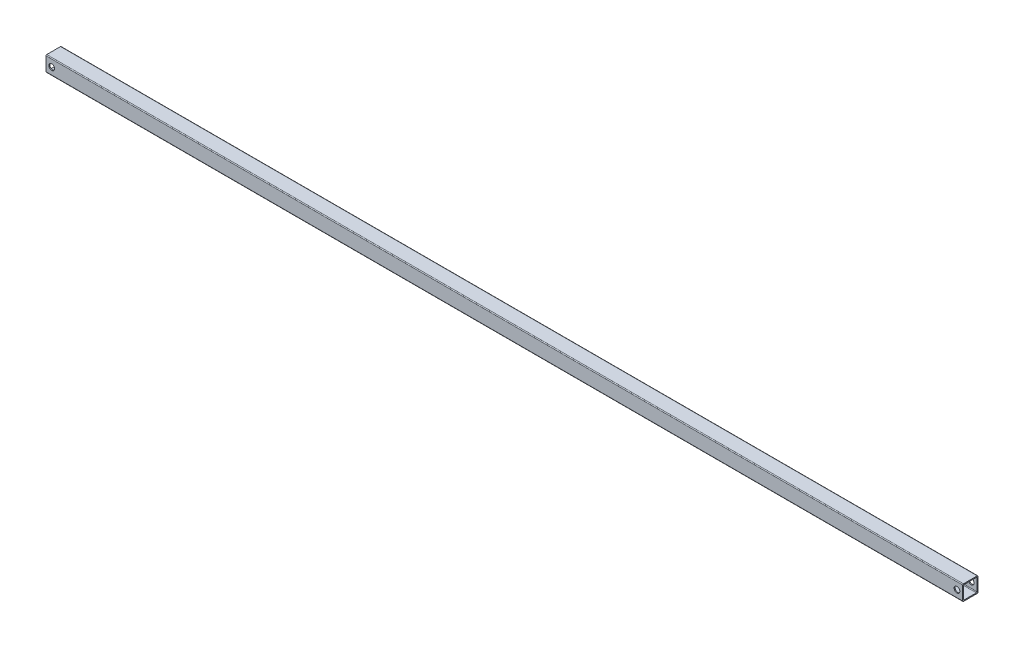
ISO-10303-21;
HEADER;
FILE_DESCRIPTION(('STEP AP214'),'2;1');
FILE_NAME('part.step','',(''),(''),'','','');
FILE_SCHEMA(('AUTOMOTIVE_DESIGN { 1 0 10303 214 1 1 1 1 }'));
ENDSEC;
DATA;
#1=APPLICATION_CONTEXT('core data for automotive mechanical design processes');
#2=APPLICATION_PROTOCOL_DEFINITION('international standard','automotive_design',2000,#1);
#3=PRODUCT_CONTEXT('',#1,'mechanical');
#4=PRODUCT('Part','Part','',(#3));
#5=PRODUCT_RELATED_PRODUCT_CATEGORY('part','',(#4));
#6=PRODUCT_DEFINITION_FORMATION('','',#4);
#7=PRODUCT_DEFINITION_CONTEXT('part definition',#1,'design');
#8=PRODUCT_DEFINITION('design','',#6,#7);
#9=PRODUCT_DEFINITION_SHAPE('','',#8);
#10=(LENGTH_UNIT() NAMED_UNIT(*) SI_UNIT(.MILLI.,.METRE.));
#11=(NAMED_UNIT(*) PLANE_ANGLE_UNIT() SI_UNIT($,.RADIAN.));
#12=(NAMED_UNIT(*) SI_UNIT($,.STERADIAN.) SOLID_ANGLE_UNIT());
#13=UNCERTAINTY_MEASURE_WITH_UNIT(LENGTH_MEASURE(1.E-05),#10,'distance_accuracy_value','');
#14=(GEOMETRIC_REPRESENTATION_CONTEXT(3) GLOBAL_UNCERTAINTY_ASSIGNED_CONTEXT((#13)) GLOBAL_UNIT_ASSIGNED_CONTEXT((#10,
#11,#12)) REPRESENTATION_CONTEXT('',''));
#15=CARTESIAN_POINT('',(0.,0.,0.));
#16=DIRECTION('',(0.,0.,1.));
#17=DIRECTION('',(1.,0.,0.));
#18=AXIS2_PLACEMENT_3D('',#15,#16,#17);
#19=CARTESIAN_POINT('',(762.,-11.43,-11.43));
#20=DIRECTION('',(1.,0.,0.));
#21=DIRECTION('',(0.,0.,-1.));
#22=AXIS2_PLACEMENT_3D('',#19,#20,#21);
#23=PLANE('',#22);
#24=CARTESIAN_POINT('',(762.,-11.43,-11.43));
#25=DIRECTION('',(1.,0.,0.));
#26=DIRECTION('',(0.,0.,-1.));
#27=AXIS2_PLACEMENT_3D('',#24,#25,#26);
#28=CIRCLE('',#27,1.27);
#29=CARTESIAN_POINT('',(762.,-12.7,-11.43));
#30=VERTEX_POINT('',#29);
#31=CARTESIAN_POINT('',(762.,-11.43,-12.7));
#32=VERTEX_POINT('',#31);
#33=EDGE_CURVE('E167',#30,#32,#28,.T.);
#34=ORIENTED_EDGE('',*,*,#33,.T.);
#35=DIRECTION('',(0.,1.,0.));
#36=VECTOR('',#35,1.);
#37=CARTESIAN_POINT('',(762.,-11.43,-12.7));
#38=LINE('',#37,#36);
#39=CARTESIAN_POINT('',(762.,11.43,-12.7));
#40=VERTEX_POINT('',#39);
#41=EDGE_CURVE('E254',#32,#40,#38,.T.);
#42=ORIENTED_EDGE('',*,*,#41,.T.);
#43=CARTESIAN_POINT('',(762.,11.43,-11.43));
#44=DIRECTION('',(1.,0.,0.));
#45=DIRECTION('',(0.,0.,-1.));
#46=AXIS2_PLACEMENT_3D('',#43,#44,#45);
#47=CIRCLE('',#46,1.27);
#48=CARTESIAN_POINT('',(762.,12.7,-11.43));
#49=VERTEX_POINT('',#48);
#50=EDGE_CURVE('E256',#40,#49,#47,.T.);
#51=ORIENTED_EDGE('',*,*,#50,.T.);
#52=DIRECTION('',(0.,0.,1.));
#53=VECTOR('',#52,1.);
#54=CARTESIAN_POINT('',(762.,12.7,-11.43));
#55=LINE('',#54,#53);
#56=CARTESIAN_POINT('',(762.,12.7,11.43));
#57=VERTEX_POINT('',#56);
#58=EDGE_CURVE('E258',#49,#57,#55,.T.);
#59=ORIENTED_EDGE('',*,*,#58,.T.);
#60=CARTESIAN_POINT('',(762.,11.43,11.43));
#61=DIRECTION('',(1.,0.,0.));
#62=DIRECTION('',(0.,0.,-1.));
#63=AXIS2_PLACEMENT_3D('',#60,#61,#62);
#64=CIRCLE('',#63,1.27);
#65=CARTESIAN_POINT('',(762.,11.43,12.7));
#66=VERTEX_POINT('',#65);
#67=EDGE_CURVE('E260',#57,#66,#64,.T.);
#68=ORIENTED_EDGE('',*,*,#67,.T.);
#69=DIRECTION('',(0.,-1.,0.));
#70=VECTOR('',#69,1.);
#71=CARTESIAN_POINT('',(762.,-11.43,12.7));
#72=LINE('',#71,#70);
#73=CARTESIAN_POINT('',(762.,-11.43,12.7));
#74=VERTEX_POINT('',#73);
#75=EDGE_CURVE('E262',#66,#74,#72,.T.);
#76=ORIENTED_EDGE('',*,*,#75,.T.);
#77=CARTESIAN_POINT('',(762.,-11.43,11.43));
#78=DIRECTION('',(1.,0.,0.));
#79=DIRECTION('',(0.,0.,-1.));
#80=AXIS2_PLACEMENT_3D('',#77,#78,#79);
#81=CIRCLE('',#80,1.27);
#82=CARTESIAN_POINT('',(762.,-12.7,11.43));
#83=VERTEX_POINT('',#82);
#84=EDGE_CURVE('E264',#74,#83,#81,.T.);
#85=ORIENTED_EDGE('',*,*,#84,.T.);
#86=DIRECTION('',(0.,0.,-1.));
#87=VECTOR('',#86,1.);
#88=CARTESIAN_POINT('',(762.,-12.7,-11.43));
#89=LINE('',#88,#87);
#90=EDGE_CURVE('E66',#83,#30,#89,.T.);
#91=ORIENTED_EDGE('',*,*,#90,.T.);
#92=EDGE_LOOP('',(#34,#42,#51,#59,#68,#76,#85,#91));
#93=FACE_BOUND('',#92,.T.);
#94=DIRECTION('',(0.,0.,1.));
#95=VECTOR('',#94,1.);
#96=CARTESIAN_POINT('',(762.,11.049,-9.94409999999999));
#97=LINE('',#96,#95);
#98=CARTESIAN_POINT('',(762.,11.049,-9.94409999999999));
#99=VERTEX_POINT('',#98);
#100=CARTESIAN_POINT('',(762.,11.049,9.94409999999999));
#101=VERTEX_POINT('',#100);
#102=EDGE_CURVE('E227',#99,#101,#97,.T.);
#103=ORIENTED_EDGE('',*,*,#102,.F.);
#104=CARTESIAN_POINT('',(762.,9.9441,-9.9441));
#105=DIRECTION('',(1.,0.,0.));
#106=DIRECTION('',(0.,0.,-1.));
#107=AXIS2_PLACEMENT_3D('',#104,#105,#106);
#108=CIRCLE('',#107,1.1049);
#109=CARTESIAN_POINT('',(762.,9.9441,-11.049));
#110=VERTEX_POINT('',#109);
#111=EDGE_CURVE('E164',#110,#99,#108,.T.);
#112=ORIENTED_EDGE('',*,*,#111,.F.);
#113=DIRECTION('',(0.,1.,0.));
#114=VECTOR('',#113,1.);
#115=CARTESIAN_POINT('',(762.,9.9441,-11.049));
#116=LINE('',#115,#114);
#117=CARTESIAN_POINT('',(762.,-9.9441,-11.049));
#118=VERTEX_POINT('',#117);
#119=EDGE_CURVE('E239',#118,#110,#116,.T.);
#120=ORIENTED_EDGE('',*,*,#119,.F.);
#121=CARTESIAN_POINT('',(762.,-9.9441,-9.9441));
#122=DIRECTION('',(1.,0.,0.));
#123=DIRECTION('',(0.,0.,-1.));
#124=AXIS2_PLACEMENT_3D('',#121,#122,#123);
#125=CIRCLE('',#124,1.1049);
#126=CARTESIAN_POINT('',(762.,-11.049,-9.94409999999999));
#127=VERTEX_POINT('',#126);
#128=EDGE_CURVE('E237',#127,#118,#125,.T.);
#129=ORIENTED_EDGE('',*,*,#128,.F.);
#130=DIRECTION('',(0.,0.,-1.));
#131=VECTOR('',#130,1.);
#132=CARTESIAN_POINT('',(762.,-11.049,-9.94409999999999));
#133=LINE('',#132,#131);
#134=CARTESIAN_POINT('',(762.,-11.049,9.94409999999999));
#135=VERTEX_POINT('',#134);
#136=EDGE_CURVE('E235',#135,#127,#133,.T.);
#137=ORIENTED_EDGE('',*,*,#136,.F.);
#138=CARTESIAN_POINT('',(762.,-9.9441,9.9441));
#139=DIRECTION('',(1.,0.,0.));
#140=DIRECTION('',(0.,0.,-1.));
#141=AXIS2_PLACEMENT_3D('',#138,#139,#140);
#142=CIRCLE('',#141,1.1049);
#143=CARTESIAN_POINT('',(762.,-9.9441,11.049));
#144=VERTEX_POINT('',#143);
#145=EDGE_CURVE('E233',#144,#135,#142,.T.);
#146=ORIENTED_EDGE('',*,*,#145,.F.);
#147=DIRECTION('',(0.,-1.,0.));
#148=VECTOR('',#147,1.);
#149=CARTESIAN_POINT('',(762.,9.94409999999999,11.049));
#150=LINE('',#149,#148);
#151=CARTESIAN_POINT('',(762.,9.94409999999999,11.049));
#152=VERTEX_POINT('',#151);
#153=EDGE_CURVE('E231',#152,#144,#150,.T.);
#154=ORIENTED_EDGE('',*,*,#153,.F.);
#155=CARTESIAN_POINT('',(762.,9.94409999999999,9.94409999999999));
#156=DIRECTION('',(1.,0.,0.));
#157=DIRECTION('',(0.,0.,-1.));
#158=AXIS2_PLACEMENT_3D('',#155,#156,#157);
#159=CIRCLE('',#158,1.10490000000001);
#160=EDGE_CURVE('E229',#101,#152,#159,.T.);
#161=ORIENTED_EDGE('',*,*,#160,.F.);
#162=EDGE_LOOP('',(#103,#112,#120,#129,#137,#146,#154,#161));
#163=FACE_BOUND('',#162,.T.);
#164=ADVANCED_FACE('F41',(#93,#163),#23,.T.);
#165=CARTESIAN_POINT('',(762.,-11.43,-11.43));
#166=DIRECTION('',(-1.,0.,0.));
#167=DIRECTION('',(0.,0.,1.));
#168=AXIS2_PLACEMENT_3D('',#165,#166,#167);
#169=CYLINDRICAL_SURFACE('',#168,1.27);
#170=DIRECTION('',(-1.,0.,0.));
#171=VECTOR('',#170,1.);
#172=CARTESIAN_POINT('',(762.,-12.7,-11.43));
#173=LINE('',#172,#171);
#174=CARTESIAN_POINT('',(-762.,-12.7,-11.43));
#175=VERTEX_POINT('',#174);
#176=EDGE_CURVE('E267',#30,#175,#173,.T.);
#177=ORIENTED_EDGE('',*,*,#176,.T.);
#178=CARTESIAN_POINT('',(-762.,-11.43,-11.43));
#179=DIRECTION('',(1.,0.,0.));
#180=DIRECTION('',(0.,0.,-1.));
#181=AXIS2_PLACEMENT_3D('',#178,#179,#180);
#182=CIRCLE('',#181,1.27);
#183=CARTESIAN_POINT('',(-762.,-11.43,-12.7));
#184=VERTEX_POINT('',#183);
#185=EDGE_CURVE('E202',#175,#184,#182,.T.);
#186=ORIENTED_EDGE('',*,*,#185,.T.);
#187=DIRECTION('',(-1.,0.,0.));
#188=VECTOR('',#187,1.);
#189=CARTESIAN_POINT('',(762.,-11.43,-12.7));
#190=LINE('',#189,#188);
#191=EDGE_CURVE('E11',#32,#184,#190,.T.);
#192=ORIENTED_EDGE('',*,*,#191,.F.);
#193=ORIENTED_EDGE('',*,*,#33,.F.);
#194=EDGE_LOOP('',(#177,#186,#192,#193));
#195=FACE_BOUND('',#194,.T.);
#196=ADVANCED_FACE('F43',(#195),#169,.T.);
#197=CARTESIAN_POINT('',(762.,-11.43,-12.7));
#198=DIRECTION('',(0.,0.,1.));
#199=DIRECTION('',(1.,0.,0.));
#200=AXIS2_PLACEMENT_3D('',#197,#198,#199);
#201=PLANE('',#200);
#202=CARTESIAN_POINT('',(752.475,0.,-12.7));
#203=DIRECTION('',(0.,0.,1.));
#204=DIRECTION('',(1.,0.,0.));
#205=AXIS2_PLACEMENT_3D('',#202,#203,#204);
#206=CIRCLE('',#205,4.76250000000001);
#207=CARTESIAN_POINT('',(757.2375,0.,-12.7));
#208=VERTEX_POINT('',#207);
#209=EDGE_CURVE('E282',#208,#208,#206,.T.);
#210=ORIENTED_EDGE('',*,*,#209,.T.);
#211=EDGE_LOOP('',(#210));
#212=FACE_BOUND('',#211,.T.);
#213=CARTESIAN_POINT('',(-752.475,0.,-12.7));
#214=DIRECTION('',(0.,0.,1.));
#215=DIRECTION('',(1.,0.,0.));
#216=AXIS2_PLACEMENT_3D('',#213,#214,#215);
#217=CIRCLE('',#216,4.76250000000001);
#218=CARTESIAN_POINT('',(-747.7125,0.,-12.7));
#219=VERTEX_POINT('',#218);
#220=EDGE_CURVE('E297',#219,#219,#217,.T.);
#221=ORIENTED_EDGE('',*,*,#220,.T.);
#222=EDGE_LOOP('',(#221));
#223=FACE_BOUND('',#222,.T.);
#224=ORIENTED_EDGE('',*,*,#191,.T.);
#225=DIRECTION('',(0.,1.,0.));
#226=VECTOR('',#225,1.);
#227=CARTESIAN_POINT('',(-762.,-11.43,-12.7));
#228=LINE('',#227,#226);
#229=CARTESIAN_POINT('',(-762.,11.43,-12.7));
#230=VERTEX_POINT('',#229);
#231=EDGE_CURVE('E205',#184,#230,#228,.T.);
#232=ORIENTED_EDGE('',*,*,#231,.T.);
#233=DIRECTION('',(-1.,0.,0.));
#234=VECTOR('',#233,1.);
#235=CARTESIAN_POINT('',(762.,11.43,-12.7));
#236=LINE('',#235,#234);
#237=EDGE_CURVE('E50',#40,#230,#236,.T.);
#238=ORIENTED_EDGE('',*,*,#237,.F.);
#239=ORIENTED_EDGE('',*,*,#41,.F.);
#240=EDGE_LOOP('',(#224,#232,#238,#239));
#241=FACE_BOUND('',#240,.T.);
#242=ADVANCED_FACE('F301',(#212,#223,#241),#201,.F.);
#243=CARTESIAN_POINT('',(762.,11.43,-11.43));
#244=DIRECTION('',(-1.,0.,0.));
#245=DIRECTION('',(0.,0.,1.));
#246=AXIS2_PLACEMENT_3D('',#243,#244,#245);
#247=CYLINDRICAL_SURFACE('',#246,1.27);
#248=ORIENTED_EDGE('',*,*,#237,.T.);
#249=CARTESIAN_POINT('',(-762.,11.43,-11.43));
#250=DIRECTION('',(1.,0.,0.));
#251=DIRECTION('',(0.,0.,-1.));
#252=AXIS2_PLACEMENT_3D('',#249,#250,#251);
#253=CIRCLE('',#252,1.27);
#254=CARTESIAN_POINT('',(-762.,12.7,-11.43));
#255=VERTEX_POINT('',#254);
#256=EDGE_CURVE('E208',#230,#255,#253,.T.);
#257=ORIENTED_EDGE('',*,*,#256,.T.);
#258=DIRECTION('',(-1.,0.,0.));
#259=VECTOR('',#258,1.);
#260=CARTESIAN_POINT('',(762.,12.7,-11.43));
#261=LINE('',#260,#259);
#262=EDGE_CURVE('E277',#49,#255,#261,.T.);
#263=ORIENTED_EDGE('',*,*,#262,.F.);
#264=ORIENTED_EDGE('',*,*,#50,.F.);
#265=EDGE_LOOP('',(#248,#257,#263,#264));
#266=FACE_BOUND('',#265,.T.);
#267=ADVANCED_FACE('F350',(#266),#247,.T.);
#268=CARTESIAN_POINT('',(762.,12.7,-11.43));
#269=DIRECTION('',(0.,-1.,0.));
#270=DIRECTION('',(0.,0.,-1.));
#271=AXIS2_PLACEMENT_3D('',#268,#269,#270);
#272=PLANE('',#271);
#273=ORIENTED_EDGE('',*,*,#262,.T.);
#274=DIRECTION('',(0.,0.,1.));
#275=VECTOR('',#274,1.);
#276=CARTESIAN_POINT('',(-762.,12.7,-11.43));
#277=LINE('',#276,#275);
#278=CARTESIAN_POINT('',(-762.,12.7,11.43));
#279=VERTEX_POINT('',#278);
#280=EDGE_CURVE('E211',#255,#279,#277,.T.);
#281=ORIENTED_EDGE('',*,*,#280,.T.);
#282=DIRECTION('',(-1.,0.,0.));
#283=VECTOR('',#282,1.);
#284=CARTESIAN_POINT('',(762.,12.7,11.43));
#285=LINE('',#284,#283);
#286=EDGE_CURVE('E275',#57,#279,#285,.T.);
#287=ORIENTED_EDGE('',*,*,#286,.F.);
#288=ORIENTED_EDGE('',*,*,#58,.F.);
#289=EDGE_LOOP('',(#273,#281,#287,#288));
#290=FACE_BOUND('',#289,.T.);
#291=ADVANCED_FACE('F346',(#290),#272,.F.);
#292=CARTESIAN_POINT('',(762.,11.43,11.43));
#293=DIRECTION('',(-1.,0.,0.));
#294=DIRECTION('',(0.,0.,1.));
#295=AXIS2_PLACEMENT_3D('',#292,#293,#294);
#296=CYLINDRICAL_SURFACE('',#295,1.27);
#297=ORIENTED_EDGE('',*,*,#286,.T.);
#298=CARTESIAN_POINT('',(-762.,11.43,11.43));
#299=DIRECTION('',(1.,0.,0.));
#300=DIRECTION('',(0.,0.,-1.));
#301=AXIS2_PLACEMENT_3D('',#298,#299,#300);
#302=CIRCLE('',#301,1.27);
#303=CARTESIAN_POINT('',(-762.,11.43,12.7));
#304=VERTEX_POINT('',#303);
#305=EDGE_CURVE('E214',#279,#304,#302,.T.);
#306=ORIENTED_EDGE('',*,*,#305,.T.);
#307=DIRECTION('',(-1.,0.,0.));
#308=VECTOR('',#307,1.);
#309=CARTESIAN_POINT('',(762.,11.43,12.7));
#310=LINE('',#309,#308);
#311=EDGE_CURVE('E273',#66,#304,#310,.T.);
#312=ORIENTED_EDGE('',*,*,#311,.F.);
#313=ORIENTED_EDGE('',*,*,#67,.F.);
#314=EDGE_LOOP('',(#297,#306,#312,#313));
#315=FACE_BOUND('',#314,.T.);
#316=ADVANCED_FACE('F342',(#315),#296,.T.);
#317=CARTESIAN_POINT('',(762.,-11.43,12.7));
#318=DIRECTION('',(0.,0.,-1.));
#319=DIRECTION('',(-1.,0.,0.));
#320=AXIS2_PLACEMENT_3D('',#317,#318,#319);
#321=PLANE('',#320);
#322=CARTESIAN_POINT('',(752.475,0.,12.7));
#323=DIRECTION('',(0.,0.,1.));
#324=DIRECTION('',(1.,0.,0.));
#325=AXIS2_PLACEMENT_3D('',#322,#323,#324);
#326=CIRCLE('',#325,4.76250000000001);
#327=CARTESIAN_POINT('',(757.2375,0.,12.7));
#328=VERTEX_POINT('',#327);
#329=EDGE_CURVE('E287',#328,#328,#326,.T.);
#330=ORIENTED_EDGE('',*,*,#329,.F.);
#331=EDGE_LOOP('',(#330));
#332=FACE_BOUND('',#331,.T.);
#333=CARTESIAN_POINT('',(-752.475,0.,12.7));
#334=DIRECTION('',(0.,0.,1.));
#335=DIRECTION('',(1.,0.,0.));
#336=AXIS2_PLACEMENT_3D('',#333,#334,#335);
#337=CIRCLE('',#336,4.76250000000001);
#338=CARTESIAN_POINT('',(-747.7125,0.,12.7));
#339=VERTEX_POINT('',#338);
#340=EDGE_CURVE('E292',#339,#339,#337,.T.);
#341=ORIENTED_EDGE('',*,*,#340,.F.);
#342=EDGE_LOOP('',(#341));
#343=FACE_BOUND('',#342,.T.);
#344=ORIENTED_EDGE('',*,*,#311,.T.);
#345=DIRECTION('',(0.,-1.,0.));
#346=VECTOR('',#345,1.);
#347=CARTESIAN_POINT('',(-762.,-11.43,12.7));
#348=LINE('',#347,#346);
#349=CARTESIAN_POINT('',(-762.,-11.43,12.7));
#350=VERTEX_POINT('',#349);
#351=EDGE_CURVE('E217',#304,#350,#348,.T.);
#352=ORIENTED_EDGE('',*,*,#351,.T.);
#353=DIRECTION('',(-1.,0.,0.));
#354=VECTOR('',#353,1.);
#355=CARTESIAN_POINT('',(762.,-11.43,12.7));
#356=LINE('',#355,#354);
#357=EDGE_CURVE('E271',#74,#350,#356,.T.);
#358=ORIENTED_EDGE('',*,*,#357,.F.);
#359=ORIENTED_EDGE('',*,*,#75,.F.);
#360=EDGE_LOOP('',(#344,#352,#358,#359));
#361=FACE_BOUND('',#360,.T.);
#362=ADVANCED_FACE('F338',(#332,#343,#361),#321,.F.);
#363=CARTESIAN_POINT('',(762.,-11.43,11.43));
#364=DIRECTION('',(-1.,0.,0.));
#365=DIRECTION('',(0.,0.,1.));
#366=AXIS2_PLACEMENT_3D('',#363,#364,#365);
#367=CYLINDRICAL_SURFACE('',#366,1.27);
#368=ORIENTED_EDGE('',*,*,#357,.T.);
#369=CARTESIAN_POINT('',(-762.,-11.43,11.43));
#370=DIRECTION('',(1.,0.,0.));
#371=DIRECTION('',(0.,0.,-1.));
#372=AXIS2_PLACEMENT_3D('',#369,#370,#371);
#373=CIRCLE('',#372,1.27);
#374=CARTESIAN_POINT('',(-762.,-12.7,11.43));
#375=VERTEX_POINT('',#374);
#376=EDGE_CURVE('E220',#350,#375,#373,.T.);
#377=ORIENTED_EDGE('',*,*,#376,.T.);
#378=DIRECTION('',(-1.,0.,0.));
#379=VECTOR('',#378,1.);
#380=CARTESIAN_POINT('',(762.,-12.7,11.43));
#381=LINE('',#380,#379);
#382=EDGE_CURVE('E269',#83,#375,#381,.T.);
#383=ORIENTED_EDGE('',*,*,#382,.F.);
#384=ORIENTED_EDGE('',*,*,#84,.F.);
#385=EDGE_LOOP('',(#368,#377,#383,#384));
#386=FACE_BOUND('',#385,.T.);
#387=ADVANCED_FACE('F334',(#386),#367,.T.);
#388=CARTESIAN_POINT('',(762.,-12.7,-11.43));
#389=DIRECTION('',(0.,1.,0.));
#390=DIRECTION('',(0.,0.,1.));
#391=AXIS2_PLACEMENT_3D('',#388,#389,#390);
#392=PLANE('',#391);
#393=ORIENTED_EDGE('',*,*,#382,.T.);
#394=DIRECTION('',(0.,0.,-1.));
#395=VECTOR('',#394,1.);
#396=CARTESIAN_POINT('',(-762.,-12.7,-11.43));
#397=LINE('',#396,#395);
#398=EDGE_CURVE('E223',#375,#175,#397,.T.);
#399=ORIENTED_EDGE('',*,*,#398,.T.);
#400=ORIENTED_EDGE('',*,*,#176,.F.);
#401=ORIENTED_EDGE('',*,*,#90,.F.);
#402=EDGE_LOOP('',(#393,#399,#400,#401));
#403=FACE_BOUND('',#402,.T.);
#404=ADVANCED_FACE('F331',(#403),#392,.F.);
#405=CARTESIAN_POINT('',(762.,9.9441,-9.9441));
#406=DIRECTION('',(-1.,0.,0.));
#407=DIRECTION('',(0.,0.,1.));
#408=AXIS2_PLACEMENT_3D('',#405,#406,#407);
#409=CYLINDRICAL_SURFACE('',#408,1.1049);
#410=DIRECTION('',(-1.,0.,0.));
#411=VECTOR('',#410,1.);
#412=CARTESIAN_POINT('',(762.,11.049,-9.94409999999999));
#413=LINE('',#412,#411);
#414=CARTESIAN_POINT('',(-762.,11.049,-9.94409999999999));
#415=VERTEX_POINT('',#414);
#416=EDGE_CURVE('E156',#99,#415,#413,.T.);
#417=ORIENTED_EDGE('',*,*,#416,.T.);
#418=CARTESIAN_POINT('',(-762.,9.9441,-9.9441));
#419=DIRECTION('',(1.,0.,0.));
#420=DIRECTION('',(0.,0.,-1.));
#421=AXIS2_PLACEMENT_3D('',#418,#419,#420);
#422=CIRCLE('',#421,1.1049);
#423=CARTESIAN_POINT('',(-762.,9.9441,-11.049));
#424=VERTEX_POINT('',#423);
#425=EDGE_CURVE('E161',#424,#415,#422,.T.);
#426=ORIENTED_EDGE('',*,*,#425,.F.);
#427=DIRECTION('',(-1.,0.,0.));
#428=VECTOR('',#427,1.);
#429=CARTESIAN_POINT('',(762.,9.9441,-11.049));
#430=LINE('',#429,#428);
#431=EDGE_CURVE('E241',#110,#424,#430,.T.);
#432=ORIENTED_EDGE('',*,*,#431,.F.);
#433=ORIENTED_EDGE('',*,*,#111,.T.);
#434=EDGE_LOOP('',(#417,#426,#432,#433));
#435=FACE_BOUND('',#434,.T.);
#436=ADVANCED_FACE('F158',(#435),#409,.F.);
#437=CARTESIAN_POINT('',(762.,11.049,-9.94409999999999));
#438=DIRECTION('',(0.,-1.,0.));
#439=DIRECTION('',(0.,0.,-1.));
#440=AXIS2_PLACEMENT_3D('',#437,#438,#439);
#441=PLANE('',#440);
#442=DIRECTION('',(-1.,0.,0.));
#443=VECTOR('',#442,1.);
#444=CARTESIAN_POINT('',(762.,11.049,9.94409999999999));
#445=LINE('',#444,#443);
#446=CARTESIAN_POINT('',(-762.,11.049,9.94409999999999));
#447=VERTEX_POINT('',#446);
#448=EDGE_CURVE('E168',#101,#447,#445,.T.);
#449=ORIENTED_EDGE('',*,*,#448,.T.);
#450=DIRECTION('',(0.,0.,1.));
#451=VECTOR('',#450,1.);
#452=CARTESIAN_POINT('',(-762.,11.049,-9.94409999999999));
#453=LINE('',#452,#451);
#454=EDGE_CURVE('E171',#415,#447,#453,.T.);
#455=ORIENTED_EDGE('',*,*,#454,.F.);
#456=ORIENTED_EDGE('',*,*,#416,.F.);
#457=ORIENTED_EDGE('',*,*,#102,.T.);
#458=EDGE_LOOP('',(#449,#455,#456,#457));
#459=FACE_BOUND('',#458,.T.);
#460=ADVANCED_FACE('F172',(#459),#441,.T.);
#461=CARTESIAN_POINT('',(762.,9.94409999999999,9.94409999999999));
#462=DIRECTION('',(-1.,0.,0.));
#463=DIRECTION('',(0.,0.,1.));
#464=AXIS2_PLACEMENT_3D('',#461,#462,#463);
#465=CYLINDRICAL_SURFACE('',#464,1.10490000000001);
#466=DIRECTION('',(-1.,0.,0.));
#467=VECTOR('',#466,1.);
#468=CARTESIAN_POINT('',(762.,9.94409999999999,11.049));
#469=LINE('',#468,#467);
#470=CARTESIAN_POINT('',(-762.,9.94409999999999,11.049));
#471=VERTEX_POINT('',#470);
#472=EDGE_CURVE('E250',#152,#471,#469,.T.);
#473=ORIENTED_EDGE('',*,*,#472,.T.);
#474=CARTESIAN_POINT('',(-762.,9.94409999999999,9.94409999999999));
#475=DIRECTION('',(1.,0.,0.));
#476=DIRECTION('',(0.,0.,-1.));
#477=AXIS2_PLACEMENT_3D('',#474,#475,#476);
#478=CIRCLE('',#477,1.10490000000001);
#479=EDGE_CURVE('E177',#447,#471,#478,.T.);
#480=ORIENTED_EDGE('',*,*,#479,.F.);
#481=ORIENTED_EDGE('',*,*,#448,.F.);
#482=ORIENTED_EDGE('',*,*,#160,.T.);
#483=EDGE_LOOP('',(#473,#480,#481,#482));
#484=FACE_BOUND('',#483,.T.);
#485=ADVANCED_FACE('F377',(#484),#465,.F.);
#486=CARTESIAN_POINT('',(762.,9.94409999999999,11.049));
#487=DIRECTION('',(0.,0.,-1.));
#488=DIRECTION('',(0.,1.,0.));
#489=AXIS2_PLACEMENT_3D('',#486,#487,#488);
#490=PLANE('',#489);
#491=CARTESIAN_POINT('',(752.475,0.,11.049));
#492=DIRECTION('',(0.,0.,-1.));
#493=DIRECTION('',(0.,1.,0.));
#494=AXIS2_PLACEMENT_3D('',#491,#492,#493);
#495=CIRCLE('',#494,4.76250000000001);
#496=CARTESIAN_POINT('',(752.475,4.76250000000001,11.049));
#497=VERTEX_POINT('',#496);
#498=EDGE_CURVE('E183',#497,#497,#495,.T.);
#499=ORIENTED_EDGE('',*,*,#498,.F.);
#500=EDGE_LOOP('',(#499));
#501=FACE_BOUND('',#500,.T.);
#502=CARTESIAN_POINT('',(-752.475,0.,11.049));
#503=DIRECTION('',(0.,0.,-1.));
#504=DIRECTION('',(0.,1.,0.));
#505=AXIS2_PLACEMENT_3D('',#502,#503,#504);
#506=CIRCLE('',#505,4.76250000000001);
#507=CARTESIAN_POINT('',(-752.475,4.76250000000001,11.049));
#508=VERTEX_POINT('',#507);
#509=EDGE_CURVE('E281',#508,#508,#506,.T.);
#510=ORIENTED_EDGE('',*,*,#509,.F.);
#511=EDGE_LOOP('',(#510));
#512=FACE_BOUND('',#511,.T.);
#513=DIRECTION('',(-1.,0.,0.));
#514=VECTOR('',#513,1.);
#515=CARTESIAN_POINT('',(762.,-9.9441,11.049));
#516=LINE('',#515,#514);
#517=CARTESIAN_POINT('',(-762.,-9.9441,11.049));
#518=VERTEX_POINT('',#517);
#519=EDGE_CURVE('E248',#144,#518,#516,.T.);
#520=ORIENTED_EDGE('',*,*,#519,.T.);
#521=DIRECTION('',(0.,-1.,0.));
#522=VECTOR('',#521,1.);
#523=CARTESIAN_POINT('',(-762.,9.94409999999999,11.049));
#524=LINE('',#523,#522);
#525=EDGE_CURVE('E190',#471,#518,#524,.T.);
#526=ORIENTED_EDGE('',*,*,#525,.F.);
#527=ORIENTED_EDGE('',*,*,#472,.F.);
#528=ORIENTED_EDGE('',*,*,#153,.T.);
#529=EDGE_LOOP('',(#520,#526,#527,#528));
#530=FACE_BOUND('',#529,.T.);
#531=ADVANCED_FACE('F373',(#501,#512,#530),#490,.T.);
#532=CARTESIAN_POINT('',(762.,-9.9441,9.9441));
#533=DIRECTION('',(-1.,0.,0.));
#534=DIRECTION('',(0.,0.,1.));
#535=AXIS2_PLACEMENT_3D('',#532,#533,#534);
#536=CYLINDRICAL_SURFACE('',#535,1.1049);
#537=DIRECTION('',(-1.,0.,0.));
#538=VECTOR('',#537,1.);
#539=CARTESIAN_POINT('',(762.,-11.049,9.94409999999999));
#540=LINE('',#539,#538);
#541=CARTESIAN_POINT('',(-762.,-11.049,9.94409999999999));
#542=VERTEX_POINT('',#541);
#543=EDGE_CURVE('E246',#135,#542,#540,.T.);
#544=ORIENTED_EDGE('',*,*,#543,.T.);
#545=CARTESIAN_POINT('',(-762.,-9.9441,9.9441));
#546=DIRECTION('',(1.,0.,0.));
#547=DIRECTION('',(0.,0.,-1.));
#548=AXIS2_PLACEMENT_3D('',#545,#546,#547);
#549=CIRCLE('',#548,1.1049);
#550=EDGE_CURVE('E193',#518,#542,#549,.T.);
#551=ORIENTED_EDGE('',*,*,#550,.F.);
#552=ORIENTED_EDGE('',*,*,#519,.F.);
#553=ORIENTED_EDGE('',*,*,#145,.T.);
#554=EDGE_LOOP('',(#544,#551,#552,#553));
#555=FACE_BOUND('',#554,.T.);
#556=ADVANCED_FACE('F376',(#555),#536,.F.);
#557=CARTESIAN_POINT('',(762.,-11.049,-9.94409999999999));
#558=DIRECTION('',(0.,1.,0.));
#559=DIRECTION('',(0.,0.,1.));
#560=AXIS2_PLACEMENT_3D('',#557,#558,#559);
#561=PLANE('',#560);
#562=DIRECTION('',(-1.,0.,0.));
#563=VECTOR('',#562,1.);
#564=CARTESIAN_POINT('',(762.,-11.049,-9.94409999999999));
#565=LINE('',#564,#563);
#566=CARTESIAN_POINT('',(-762.,-11.049,-9.94409999999999));
#567=VERTEX_POINT('',#566);
#568=EDGE_CURVE('E244',#127,#567,#565,.T.);
#569=ORIENTED_EDGE('',*,*,#568,.T.);
#570=DIRECTION('',(0.,0.,-1.));
#571=VECTOR('',#570,1.);
#572=CARTESIAN_POINT('',(-762.,-11.049,-9.94409999999999));
#573=LINE('',#572,#571);
#574=EDGE_CURVE('E196',#542,#567,#573,.T.);
#575=ORIENTED_EDGE('',*,*,#574,.F.);
#576=ORIENTED_EDGE('',*,*,#543,.F.);
#577=ORIENTED_EDGE('',*,*,#136,.T.);
#578=EDGE_LOOP('',(#569,#575,#576,#577));
#579=FACE_BOUND('',#578,.T.);
#580=ADVANCED_FACE('F472',(#579),#561,.T.);
#581=CARTESIAN_POINT('',(762.,-9.9441,-9.9441));
#582=DIRECTION('',(-1.,0.,0.));
#583=DIRECTION('',(0.,0.,1.));
#584=AXIS2_PLACEMENT_3D('',#581,#582,#583);
#585=CYLINDRICAL_SURFACE('',#584,1.1049);
#586=DIRECTION('',(-1.,0.,0.));
#587=VECTOR('',#586,1.);
#588=CARTESIAN_POINT('',(762.,-9.9441,-11.049));
#589=LINE('',#588,#587);
#590=CARTESIAN_POINT('',(-762.,-9.9441,-11.049));
#591=VERTEX_POINT('',#590);
#592=EDGE_CURVE('E58',#118,#591,#589,.T.);
#593=ORIENTED_EDGE('',*,*,#592,.T.);
#594=CARTESIAN_POINT('',(-762.,-9.9441,-9.9441));
#595=DIRECTION('',(1.,0.,0.));
#596=DIRECTION('',(0.,0.,-1.));
#597=AXIS2_PLACEMENT_3D('',#594,#595,#596);
#598=CIRCLE('',#597,1.1049);
#599=EDGE_CURVE('E199',#567,#591,#598,.T.);
#600=ORIENTED_EDGE('',*,*,#599,.F.);
#601=ORIENTED_EDGE('',*,*,#568,.F.);
#602=ORIENTED_EDGE('',*,*,#128,.T.);
#603=EDGE_LOOP('',(#593,#600,#601,#602));
#604=FACE_BOUND('',#603,.T.);
#605=ADVANCED_FACE('F387',(#604),#585,.F.);
#606=CARTESIAN_POINT('',(762.,9.9441,-11.049));
#607=DIRECTION('',(0.,0.,1.));
#608=DIRECTION('',(1.,0.,0.));
#609=AXIS2_PLACEMENT_3D('',#606,#607,#608);
#610=PLANE('',#609);
#611=CARTESIAN_POINT('',(752.475,0.,-11.049));
#612=DIRECTION('',(0.,0.,1.));
#613=DIRECTION('',(1.,0.,0.));
#614=AXIS2_PLACEMENT_3D('',#611,#612,#613);
#615=CIRCLE('',#614,4.76250000000001);
#616=CARTESIAN_POINT('',(757.2375,0.,-11.049));
#617=VERTEX_POINT('',#616);
#618=EDGE_CURVE('E45',#617,#617,#615,.T.);
#619=ORIENTED_EDGE('',*,*,#618,.F.);
#620=EDGE_LOOP('',(#619));
#621=FACE_BOUND('',#620,.T.);
#622=CARTESIAN_POINT('',(-752.475,0.,-11.049));
#623=DIRECTION('',(0.,0.,1.));
#624=DIRECTION('',(1.,0.,0.));
#625=AXIS2_PLACEMENT_3D('',#622,#623,#624);
#626=CIRCLE('',#625,4.76250000000001);
#627=CARTESIAN_POINT('',(-747.7125,0.,-11.049));
#628=VERTEX_POINT('',#627);
#629=EDGE_CURVE('E279',#628,#628,#626,.T.);
#630=ORIENTED_EDGE('',*,*,#629,.F.);
#631=EDGE_LOOP('',(#630));
#632=FACE_BOUND('',#631,.T.);
#633=ORIENTED_EDGE('',*,*,#431,.T.);
#634=DIRECTION('',(0.,1.,0.));
#635=VECTOR('',#634,1.);
#636=CARTESIAN_POINT('',(-762.,9.9441,-11.049));
#637=LINE('',#636,#635);
#638=EDGE_CURVE('E182',#591,#424,#637,.T.);
#639=ORIENTED_EDGE('',*,*,#638,.F.);
#640=ORIENTED_EDGE('',*,*,#592,.F.);
#641=ORIENTED_EDGE('',*,*,#119,.T.);
#642=EDGE_LOOP('',(#633,#639,#640,#641));
#643=FACE_BOUND('',#642,.T.);
#644=ADVANCED_FACE('F317',(#621,#632,#643),#610,.T.);
#645=CARTESIAN_POINT('',(-762.,-11.43,-11.43));
#646=DIRECTION('',(1.,0.,0.));
#647=DIRECTION('',(0.,0.,-1.));
#648=AXIS2_PLACEMENT_3D('',#645,#646,#647);
#649=PLANE('',#648);
#650=ORIENTED_EDGE('',*,*,#638,.T.);
#651=ORIENTED_EDGE('',*,*,#425,.T.);
#652=ORIENTED_EDGE('',*,*,#454,.T.);
#653=ORIENTED_EDGE('',*,*,#479,.T.);
#654=ORIENTED_EDGE('',*,*,#525,.T.);
#655=ORIENTED_EDGE('',*,*,#550,.T.);
#656=ORIENTED_EDGE('',*,*,#574,.T.);
#657=ORIENTED_EDGE('',*,*,#599,.T.);
#658=EDGE_LOOP('',(#650,#651,#652,#653,#654,#655,#656,#657));
#659=FACE_BOUND('',#658,.T.);
#660=ORIENTED_EDGE('',*,*,#185,.F.);
#661=ORIENTED_EDGE('',*,*,#398,.F.);
#662=ORIENTED_EDGE('',*,*,#376,.F.);
#663=ORIENTED_EDGE('',*,*,#351,.F.);
#664=ORIENTED_EDGE('',*,*,#305,.F.);
#665=ORIENTED_EDGE('',*,*,#280,.F.);
#666=ORIENTED_EDGE('',*,*,#256,.F.);
#667=ORIENTED_EDGE('',*,*,#231,.F.);
#668=EDGE_LOOP('',(#660,#661,#662,#663,#664,#665,#666,#667));
#669=FACE_BOUND('',#668,.T.);
#670=ADVANCED_FACE('F179',(#659,#669),#649,.F.);
#671=CARTESIAN_POINT('',(-752.475,0.,-12.7));
#672=DIRECTION('',(0.,0.,1.));
#673=DIRECTION('',(1.,0.,0.));
#674=AXIS2_PLACEMENT_3D('',#671,#672,#673);
#675=CYLINDRICAL_SURFACE('',#674,4.76250000000001);
#676=ORIENTED_EDGE('',*,*,#629,.T.);
#677=EDGE_LOOP('',(#676));
#678=FACE_BOUND('',#677,.T.);
#679=ORIENTED_EDGE('',*,*,#220,.F.);
#680=EDGE_LOOP('',(#679));
#681=FACE_BOUND('',#680,.T.);
#682=ADVANCED_FACE('F304',(#678,#681),#675,.F.);
#683=CARTESIAN_POINT('',(752.475,0.,-12.7));
#684=DIRECTION('',(0.,0.,1.));
#685=DIRECTION('',(1.,0.,0.));
#686=AXIS2_PLACEMENT_3D('',#683,#684,#685);
#687=CYLINDRICAL_SURFACE('',#686,4.76250000000001);
#688=ORIENTED_EDGE('',*,*,#618,.T.);
#689=EDGE_LOOP('',(#688));
#690=FACE_BOUND('',#689,.T.);
#691=ORIENTED_EDGE('',*,*,#209,.F.);
#692=EDGE_LOOP('',(#691));
#693=FACE_BOUND('',#692,.T.);
#694=ADVANCED_FACE('F306',(#690,#693),#687,.F.);
#695=ORIENTED_EDGE('',*,*,#509,.T.);
#696=EDGE_LOOP('',(#695));
#697=FACE_BOUND('',#696,.T.);
#698=ORIENTED_EDGE('',*,*,#340,.T.);
#699=EDGE_LOOP('',(#698));
#700=FACE_BOUND('',#699,.T.);
#701=ADVANCED_FACE('F308',(#697,#700),#675,.F.);
#702=ORIENTED_EDGE('',*,*,#498,.T.);
#703=EDGE_LOOP('',(#702));
#704=FACE_BOUND('',#703,.T.);
#705=ORIENTED_EDGE('',*,*,#329,.T.);
#706=EDGE_LOOP('',(#705));
#707=FACE_BOUND('',#706,.T.);
#708=ADVANCED_FACE('F315',(#704,#707),#687,.F.);
#709=CLOSED_SHELL('',(#164,#196,#242,#267,#291,#316,#362,#387,#404,#436,#460,#485,#531,#556,
#580,#605,#644,#670,#682,#694,#701,#708));
#710=MANIFOLD_SOLID_BREP('B2',#709);
#711=ADVANCED_BREP_SHAPE_REPRESENTATION('',(#18,#710),#14);
#712=SHAPE_DEFINITION_REPRESENTATION(#9,#711);
ENDSEC;
END-ISO-10303-21;
